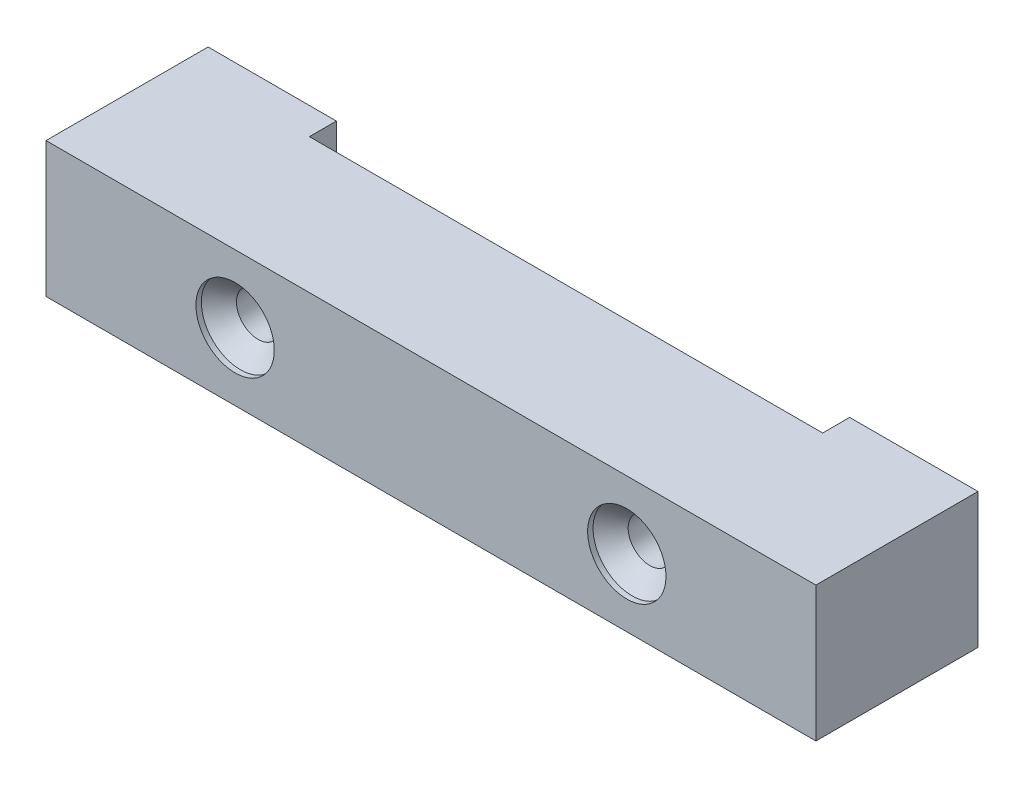
ISO-10303-21;
HEADER;
FILE_DESCRIPTION(('STEP AP214'),'2;1');
FILE_NAME('part.step','',(''),(''),'','','');
FILE_SCHEMA(('AUTOMOTIVE_DESIGN { 1 0 10303 214 1 1 1 1 }'));
ENDSEC;
DATA;
#1=APPLICATION_CONTEXT('core data for automotive mechanical design processes');
#2=APPLICATION_PROTOCOL_DEFINITION('international standard','automotive_design',2000,#1);
#3=PRODUCT_CONTEXT('',#1,'mechanical');
#4=PRODUCT('Part','Part','',(#3));
#5=PRODUCT_RELATED_PRODUCT_CATEGORY('part','',(#4));
#6=PRODUCT_DEFINITION_FORMATION('','',#4);
#7=PRODUCT_DEFINITION_CONTEXT('part definition',#1,'design');
#8=PRODUCT_DEFINITION('design','',#6,#7);
#9=PRODUCT_DEFINITION_SHAPE('','',#8);
#10=(LENGTH_UNIT() NAMED_UNIT(*) SI_UNIT(.MILLI.,.METRE.));
#11=(NAMED_UNIT(*) PLANE_ANGLE_UNIT() SI_UNIT($,.RADIAN.));
#12=(NAMED_UNIT(*) SI_UNIT($,.STERADIAN.) SOLID_ANGLE_UNIT());
#13=UNCERTAINTY_MEASURE_WITH_UNIT(LENGTH_MEASURE(1.E-05),#10,'distance_accuracy_value','');
#14=(GEOMETRIC_REPRESENTATION_CONTEXT(3) GLOBAL_UNCERTAINTY_ASSIGNED_CONTEXT((#13)) GLOBAL_UNIT_ASSIGNED_CONTEXT((#10,
#11,#12)) REPRESENTATION_CONTEXT('',''));
#15=CARTESIAN_POINT('',(0.,0.,0.));
#16=DIRECTION('',(0.,0.,1.));
#17=DIRECTION('',(1.,0.,0.));
#18=AXIS2_PLACEMENT_3D('',#15,#16,#17);
#19=CARTESIAN_POINT('',(28.5,10.,5.));
#20=DIRECTION('',(-1.,0.,0.));
#21=DIRECTION('',(0.,0.,1.));
#22=AXIS2_PLACEMENT_3D('',#19,#20,#21);
#23=PLANE('',#22);
#24=DIRECTION('',(0.,0.,-1.));
#25=VECTOR('',#24,1.);
#26=CARTESIAN_POINT('',(28.5,0.,5.));
#27=LINE('',#26,#25);
#28=CARTESIAN_POINT('',(28.5,0.,5.));
#29=VERTEX_POINT('',#28);
#30=CARTESIAN_POINT('',(28.5,0.,-7.));
#31=VERTEX_POINT('',#30);
#32=EDGE_CURVE('E130',#29,#31,#27,.T.);
#33=ORIENTED_EDGE('',*,*,#32,.T.);
#34=DIRECTION('',(0.,-1.,0.));
#35=VECTOR('',#34,1.);
#36=CARTESIAN_POINT('',(28.5,10.,-7.));
#37=LINE('',#36,#35);
#38=CARTESIAN_POINT('',(28.5,10.,-7.));
#39=VERTEX_POINT('',#38);
#40=EDGE_CURVE('E11',#39,#31,#37,.T.);
#41=ORIENTED_EDGE('',*,*,#40,.F.);
#42=DIRECTION('',(0.,0.,-1.));
#43=VECTOR('',#42,1.);
#44=CARTESIAN_POINT('',(28.5,10.,5.));
#45=LINE('',#44,#43);
#46=CARTESIAN_POINT('',(28.5,10.,5.));
#47=VERTEX_POINT('',#46);
#48=EDGE_CURVE('E145',#47,#39,#45,.T.);
#49=ORIENTED_EDGE('',*,*,#48,.F.);
#50=DIRECTION('',(0.,-1.,0.));
#51=VECTOR('',#50,1.);
#52=CARTESIAN_POINT('',(28.5,10.,5.));
#53=LINE('',#52,#51);
#54=EDGE_CURVE('E126',#47,#29,#53,.T.);
#55=ORIENTED_EDGE('',*,*,#54,.T.);
#56=EDGE_LOOP('',(#33,#41,#49,#55));
#57=FACE_BOUND('',#56,.T.);
#58=ADVANCED_FACE('F32',(#57),#23,.F.);
#59=CARTESIAN_POINT('',(28.5,10.,-7.));
#60=DIRECTION('',(0.,0.,1.));
#61=DIRECTION('',(1.,0.,0.));
#62=AXIS2_PLACEMENT_3D('',#59,#60,#61);
#63=PLANE('',#62);
#64=CARTESIAN_POINT('',(23.5,5.00000000000001,-7.));
#65=DIRECTION('',(0.,0.,-1.));
#66=DIRECTION('',(-1.,0.,0.));
#67=AXIS2_PLACEMENT_3D('',#64,#65,#66);
#68=CIRCLE('',#67,1.55);
#69=CARTESIAN_POINT('',(21.95,5.00000000000001,-7.));
#70=VERTEX_POINT('',#69);
#71=EDGE_CURVE('E158',#70,#70,#68,.T.);
#72=ORIENTED_EDGE('',*,*,#71,.F.);
#73=EDGE_LOOP('',(#72));
#74=FACE_BOUND('',#73,.T.);
#75=DIRECTION('',(-1.,0.,0.));
#76=VECTOR('',#75,1.);
#77=CARTESIAN_POINT('',(28.5,0.,-7.));
#78=LINE('',#77,#76);
#79=CARTESIAN_POINT('',(19.,0.,-7.));
#80=VERTEX_POINT('',#79);
#81=EDGE_CURVE('E133',#31,#80,#78,.T.);
#82=ORIENTED_EDGE('',*,*,#81,.T.);
#83=DIRECTION('',(0.,-1.,0.));
#84=VECTOR('',#83,1.);
#85=CARTESIAN_POINT('',(19.,10.,-7.));
#86=LINE('',#85,#84);
#87=CARTESIAN_POINT('',(19.,10.,-7.));
#88=VERTEX_POINT('',#87);
#89=EDGE_CURVE('E41',#88,#80,#86,.T.);
#90=ORIENTED_EDGE('',*,*,#89,.F.);
#91=DIRECTION('',(-1.,0.,0.));
#92=VECTOR('',#91,1.);
#93=CARTESIAN_POINT('',(28.5,10.,-7.));
#94=LINE('',#93,#92);
#95=EDGE_CURVE('E93',#39,#88,#94,.T.);
#96=ORIENTED_EDGE('',*,*,#95,.F.);
#97=ORIENTED_EDGE('',*,*,#40,.T.);
#98=EDGE_LOOP('',(#82,#90,#96,#97));
#99=FACE_BOUND('',#98,.T.);
#100=ADVANCED_FACE('F212',(#74,#99),#63,.F.);
#101=CARTESIAN_POINT('',(19.,10.,-7.));
#102=DIRECTION('',(1.,0.,0.));
#103=DIRECTION('',(0.,0.,-1.));
#104=AXIS2_PLACEMENT_3D('',#101,#102,#103);
#105=PLANE('',#104);
#106=DIRECTION('',(0.,0.,1.));
#107=VECTOR('',#106,1.);
#108=CARTESIAN_POINT('',(19.,0.,-7.));
#109=LINE('',#108,#107);
#110=CARTESIAN_POINT('',(19.,0.,-5.));
#111=VERTEX_POINT('',#110);
#112=EDGE_CURVE('E136',#80,#111,#109,.T.);
#113=ORIENTED_EDGE('',*,*,#112,.T.);
#114=DIRECTION('',(0.,-1.,0.));
#115=VECTOR('',#114,1.);
#116=CARTESIAN_POINT('',(19.,10.,-5.));
#117=LINE('',#116,#115);
#118=CARTESIAN_POINT('',(19.,10.,-5.));
#119=VERTEX_POINT('',#118);
#120=EDGE_CURVE('E152',#119,#111,#117,.T.);
#121=ORIENTED_EDGE('',*,*,#120,.F.);
#122=DIRECTION('',(0.,0.,1.));
#123=VECTOR('',#122,1.);
#124=CARTESIAN_POINT('',(19.,10.,-7.));
#125=LINE('',#124,#123);
#126=EDGE_CURVE('E178',#88,#119,#125,.T.);
#127=ORIENTED_EDGE('',*,*,#126,.F.);
#128=ORIENTED_EDGE('',*,*,#89,.T.);
#129=EDGE_LOOP('',(#113,#121,#127,#128));
#130=FACE_BOUND('',#129,.T.);
#131=ADVANCED_FACE('F216',(#130),#105,.F.);
#132=CARTESIAN_POINT('',(19.,10.,-5.));
#133=DIRECTION('',(0.,0.,1.));
#134=DIRECTION('',(1.,0.,0.));
#135=AXIS2_PLACEMENT_3D('',#132,#133,#134);
#136=PLANE('',#135);
#137=CARTESIAN_POINT('',(-14.5,5.00000000000001,-5.));
#138=DIRECTION('',(0.,0.,1.));
#139=DIRECTION('',(1.,0.,0.));
#140=AXIS2_PLACEMENT_3D('',#137,#138,#139);
#141=CIRCLE('',#140,1.6);
#142=CARTESIAN_POINT('',(-12.9,5.00000000000001,-5.));
#143=VERTEX_POINT('',#142);
#144=EDGE_CURVE('E35',#143,#143,#141,.T.);
#145=ORIENTED_EDGE('',*,*,#144,.T.);
#146=EDGE_LOOP('',(#145));
#147=FACE_BOUND('',#146,.T.);
#148=CARTESIAN_POINT('',(14.5,5.00000000000001,-5.));
#149=DIRECTION('',(0.,0.,1.));
#150=DIRECTION('',(1.,0.,0.));
#151=AXIS2_PLACEMENT_3D('',#148,#149,#150);
#152=CIRCLE('',#151,1.6);
#153=CARTESIAN_POINT('',(16.1,5.00000000000001,-5.));
#154=VERTEX_POINT('',#153);
#155=EDGE_CURVE('E156',#154,#154,#152,.T.);
#156=ORIENTED_EDGE('',*,*,#155,.T.);
#157=EDGE_LOOP('',(#156));
#158=FACE_BOUND('',#157,.T.);
#159=DIRECTION('',(-1.,0.,0.));
#160=VECTOR('',#159,1.);
#161=CARTESIAN_POINT('',(19.,0.,-5.));
#162=LINE('',#161,#160);
#163=CARTESIAN_POINT('',(-19.,0.,-5.));
#164=VERTEX_POINT('',#163);
#165=EDGE_CURVE('E138',#111,#164,#162,.T.);
#166=ORIENTED_EDGE('',*,*,#165,.T.);
#167=DIRECTION('',(0.,-1.,0.));
#168=VECTOR('',#167,1.);
#169=CARTESIAN_POINT('',(-19.,10.,-5.));
#170=LINE('',#169,#168);
#171=CARTESIAN_POINT('',(-19.,10.,-5.));
#172=VERTEX_POINT('',#171);
#173=EDGE_CURVE('E149',#172,#164,#170,.T.);
#174=ORIENTED_EDGE('',*,*,#173,.F.);
#175=DIRECTION('',(-1.,0.,0.));
#176=VECTOR('',#175,1.);
#177=CARTESIAN_POINT('',(19.,10.,-5.));
#178=LINE('',#177,#176);
#179=EDGE_CURVE('E180',#119,#172,#178,.T.);
#180=ORIENTED_EDGE('',*,*,#179,.F.);
#181=ORIENTED_EDGE('',*,*,#120,.T.);
#182=EDGE_LOOP('',(#166,#174,#180,#181));
#183=FACE_BOUND('',#182,.T.);
#184=ADVANCED_FACE('F186',(#147,#158,#183),#136,.F.);
#185=CARTESIAN_POINT('',(-19.,10.,-7.));
#186=DIRECTION('',(-1.,0.,0.));
#187=DIRECTION('',(0.,0.,1.));
#188=AXIS2_PLACEMENT_3D('',#185,#186,#187);
#189=PLANE('',#188);
#190=DIRECTION('',(0.,0.,-1.));
#191=VECTOR('',#190,1.);
#192=CARTESIAN_POINT('',(-19.,0.,-7.));
#193=LINE('',#192,#191);
#194=CARTESIAN_POINT('',(-19.,0.,-7.));
#195=VERTEX_POINT('',#194);
#196=EDGE_CURVE('E140',#164,#195,#193,.T.);
#197=ORIENTED_EDGE('',*,*,#196,.T.);
#198=DIRECTION('',(0.,-1.,0.));
#199=VECTOR('',#198,1.);
#200=CARTESIAN_POINT('',(-19.,10.,-7.));
#201=LINE('',#200,#199);
#202=CARTESIAN_POINT('',(-19.,10.,-7.));
#203=VERTEX_POINT('',#202);
#204=EDGE_CURVE('E121',#203,#195,#201,.T.);
#205=ORIENTED_EDGE('',*,*,#204,.F.);
#206=DIRECTION('',(0.,0.,-1.));
#207=VECTOR('',#206,1.);
#208=CARTESIAN_POINT('',(-19.,10.,-7.));
#209=LINE('',#208,#207);
#210=EDGE_CURVE('E112',#172,#203,#209,.T.);
#211=ORIENTED_EDGE('',*,*,#210,.F.);
#212=ORIENTED_EDGE('',*,*,#173,.T.);
#213=EDGE_LOOP('',(#197,#205,#211,#212));
#214=FACE_BOUND('',#213,.T.);
#215=ADVANCED_FACE('F190',(#214),#189,.F.);
#216=CARTESIAN_POINT('',(-28.5,10.,-7.));
#217=DIRECTION('',(0.,0.,1.));
#218=DIRECTION('',(1.,0.,0.));
#219=AXIS2_PLACEMENT_3D('',#216,#217,#218);
#220=PLANE('',#219);
#221=CARTESIAN_POINT('',(-23.5,5.00000000000001,-7.));
#222=DIRECTION('',(0.,0.,1.));
#223=DIRECTION('',(1.,0.,0.));
#224=AXIS2_PLACEMENT_3D('',#221,#222,#223);
#225=CIRCLE('',#224,1.55);
#226=CARTESIAN_POINT('',(-21.95,5.00000000000001,-7.));
#227=VERTEX_POINT('',#226);
#228=EDGE_CURVE('E236',#227,#227,#225,.T.);
#229=ORIENTED_EDGE('',*,*,#228,.T.);
#230=EDGE_LOOP('',(#229));
#231=FACE_BOUND('',#230,.T.);
#232=DIRECTION('',(-1.,0.,0.));
#233=VECTOR('',#232,1.);
#234=CARTESIAN_POINT('',(-28.5,0.,-7.));
#235=LINE('',#234,#233);
#236=CARTESIAN_POINT('',(-28.5,0.,-7.));
#237=VERTEX_POINT('',#236);
#238=EDGE_CURVE('E120',#195,#237,#235,.T.);
#239=ORIENTED_EDGE('',*,*,#238,.T.);
#240=DIRECTION('',(0.,-1.,0.));
#241=VECTOR('',#240,1.);
#242=CARTESIAN_POINT('',(-28.5,10.,-7.));
#243=LINE('',#242,#241);
#244=CARTESIAN_POINT('',(-28.5,10.,-7.));
#245=VERTEX_POINT('',#244);
#246=EDGE_CURVE('E117',#245,#237,#243,.T.);
#247=ORIENTED_EDGE('',*,*,#246,.F.);
#248=DIRECTION('',(-1.,0.,0.));
#249=VECTOR('',#248,1.);
#250=CARTESIAN_POINT('',(-28.5,10.,-7.));
#251=LINE('',#250,#249);
#252=EDGE_CURVE('E106',#203,#245,#251,.T.);
#253=ORIENTED_EDGE('',*,*,#252,.F.);
#254=ORIENTED_EDGE('',*,*,#204,.T.);
#255=EDGE_LOOP('',(#239,#247,#253,#254));
#256=FACE_BOUND('',#255,.T.);
#257=ADVANCED_FACE('F118',(#231,#256),#220,.F.);
#258=CARTESIAN_POINT('',(-28.5,10.,5.));
#259=DIRECTION('',(1.,0.,0.));
#260=DIRECTION('',(0.,0.,-1.));
#261=AXIS2_PLACEMENT_3D('',#258,#259,#260);
#262=PLANE('',#261);
#263=DIRECTION('',(0.,0.,1.));
#264=VECTOR('',#263,1.);
#265=CARTESIAN_POINT('',(-28.5,0.,5.));
#266=LINE('',#265,#264);
#267=CARTESIAN_POINT('',(-28.5,0.,5.));
#268=VERTEX_POINT('',#267);
#269=EDGE_CURVE('E79',#237,#268,#266,.T.);
#270=ORIENTED_EDGE('',*,*,#269,.T.);
#271=DIRECTION('',(0.,-1.,0.));
#272=VECTOR('',#271,1.);
#273=CARTESIAN_POINT('',(-28.5,10.,5.));
#274=LINE('',#273,#272);
#275=CARTESIAN_POINT('',(-28.5,10.,5.));
#276=VERTEX_POINT('',#275);
#277=EDGE_CURVE('E122',#276,#268,#274,.T.);
#278=ORIENTED_EDGE('',*,*,#277,.F.);
#279=DIRECTION('',(0.,0.,1.));
#280=VECTOR('',#279,1.);
#281=CARTESIAN_POINT('',(-28.5,10.,5.));
#282=LINE('',#281,#280);
#283=EDGE_CURVE('E110',#245,#276,#282,.T.);
#284=ORIENTED_EDGE('',*,*,#283,.F.);
#285=ORIENTED_EDGE('',*,*,#246,.T.);
#286=EDGE_LOOP('',(#270,#278,#284,#285));
#287=FACE_BOUND('',#286,.T.);
#288=ADVANCED_FACE('F124',(#287),#262,.F.);
#289=CARTESIAN_POINT('',(-28.5,10.,5.));
#290=DIRECTION('',(0.,0.,-1.));
#291=DIRECTION('',(-1.,0.,0.));
#292=AXIS2_PLACEMENT_3D('',#289,#290,#291);
#293=PLANE('',#292);
#294=CARTESIAN_POINT('',(-14.5,5.00000000000001,5.));
#295=DIRECTION('',(0.,0.,1.));
#296=DIRECTION('',(1.,0.,0.));
#297=AXIS2_PLACEMENT_3D('',#294,#295,#296);
#298=CIRCLE('',#297,2.9);
#299=CARTESIAN_POINT('',(-11.6,5.00000000000001,5.));
#300=VERTEX_POINT('',#299);
#301=EDGE_CURVE('E372',#300,#300,#298,.T.);
#302=ORIENTED_EDGE('',*,*,#301,.F.);
#303=EDGE_LOOP('',(#302));
#304=FACE_BOUND('',#303,.T.);
#305=CARTESIAN_POINT('',(14.5,5.00000000000001,5.));
#306=DIRECTION('',(0.,0.,1.));
#307=DIRECTION('',(1.,0.,0.));
#308=AXIS2_PLACEMENT_3D('',#305,#306,#307);
#309=CIRCLE('',#308,2.9);
#310=CARTESIAN_POINT('',(17.4,5.00000000000001,5.));
#311=VERTEX_POINT('',#310);
#312=EDGE_CURVE('E170',#311,#311,#309,.T.);
#313=ORIENTED_EDGE('',*,*,#312,.F.);
#314=EDGE_LOOP('',(#313));
#315=FACE_BOUND('',#314,.T.);
#316=DIRECTION('',(1.,0.,0.));
#317=VECTOR('',#316,1.);
#318=CARTESIAN_POINT('',(-28.5,0.,5.));
#319=LINE('',#318,#317);
#320=EDGE_CURVE('E85',#268,#29,#319,.T.);
#321=ORIENTED_EDGE('',*,*,#320,.T.);
#322=ORIENTED_EDGE('',*,*,#54,.F.);
#323=DIRECTION('',(1.,0.,0.));
#324=VECTOR('',#323,1.);
#325=CARTESIAN_POINT('',(-28.5,10.,5.));
#326=LINE('',#325,#324);
#327=EDGE_CURVE('E50',#276,#47,#326,.T.);
#328=ORIENTED_EDGE('',*,*,#327,.F.);
#329=ORIENTED_EDGE('',*,*,#277,.T.);
#330=EDGE_LOOP('',(#321,#322,#328,#329));
#331=FACE_BOUND('',#330,.T.);
#332=ADVANCED_FACE('F198',(#304,#315,#331),#293,.F.);
#333=CARTESIAN_POINT('',(0.,10.,0.));
#334=DIRECTION('',(0.,1.,0.));
#335=DIRECTION('',(0.,0.,1.));
#336=AXIS2_PLACEMENT_3D('',#333,#334,#335);
#337=PLANE('',#336);
#338=ORIENTED_EDGE('',*,*,#48,.T.);
#339=ORIENTED_EDGE('',*,*,#95,.T.);
#340=ORIENTED_EDGE('',*,*,#126,.T.);
#341=ORIENTED_EDGE('',*,*,#179,.T.);
#342=ORIENTED_EDGE('',*,*,#210,.T.);
#343=ORIENTED_EDGE('',*,*,#252,.T.);
#344=ORIENTED_EDGE('',*,*,#283,.T.);
#345=ORIENTED_EDGE('',*,*,#327,.T.);
#346=EDGE_LOOP('',(#338,#339,#340,#341,#342,#343,#344,#345));
#347=FACE_BOUND('',#346,.T.);
#348=ADVANCED_FACE('F108',(#347),#337,.T.);
#349=CARTESIAN_POINT('',(0.,0.,0.));
#350=DIRECTION('',(0.,1.,0.));
#351=DIRECTION('',(0.,0.,1.));
#352=AXIS2_PLACEMENT_3D('',#349,#350,#351);
#353=PLANE('',#352);
#354=ORIENTED_EDGE('',*,*,#32,.F.);
#355=ORIENTED_EDGE('',*,*,#320,.F.);
#356=ORIENTED_EDGE('',*,*,#269,.F.);
#357=ORIENTED_EDGE('',*,*,#238,.F.);
#358=ORIENTED_EDGE('',*,*,#196,.F.);
#359=ORIENTED_EDGE('',*,*,#165,.F.);
#360=ORIENTED_EDGE('',*,*,#112,.F.);
#361=ORIENTED_EDGE('',*,*,#81,.F.);
#362=EDGE_LOOP('',(#354,#355,#356,#357,#358,#359,#360,#361));
#363=FACE_BOUND('',#362,.T.);
#364=ADVANCED_FACE('F193',(#363),#353,.F.);
#365=CARTESIAN_POINT('',(23.5,5.00000000000001,0.));
#366=DIRECTION('',(0.,0.,-1.));
#367=DIRECTION('',(-1.,0.,0.));
#368=AXIS2_PLACEMENT_3D('',#365,#366,#367);
#369=CYLINDRICAL_SURFACE('',#368,1.55);
#370=CARTESIAN_POINT('',(23.5,5.00000000000001,0.));
#371=DIRECTION('',(0.,0.,-1.));
#372=DIRECTION('',(-1.,0.,0.));
#373=AXIS2_PLACEMENT_3D('',#370,#371,#372);
#374=CIRCLE('',#373,1.55);
#375=CARTESIAN_POINT('',(21.95,5.00000000000001,0.));
#376=VERTEX_POINT('',#375);
#377=EDGE_CURVE('E134',#376,#376,#374,.T.);
#378=ORIENTED_EDGE('',*,*,#377,.F.);
#379=EDGE_LOOP('',(#378));
#380=FACE_BOUND('',#379,.T.);
#381=ORIENTED_EDGE('',*,*,#71,.T.);
#382=EDGE_LOOP('',(#381));
#383=FACE_BOUND('',#382,.T.);
#384=ADVANCED_FACE('F272',(#380,#383),#369,.F.);
#385=CARTESIAN_POINT('',(23.5,5.00000000000001,0.));
#386=DIRECTION('',(0.,0.,-1.));
#387=DIRECTION('',(-1.,0.,0.));
#388=AXIS2_PLACEMENT_3D('',#385,#386,#387);
#389=PLANE('',#388);
#390=ORIENTED_EDGE('',*,*,#377,.T.);
#391=EDGE_LOOP('',(#390));
#392=FACE_BOUND('',#391,.T.);
#393=ADVANCED_FACE('F269',(#392),#389,.T.);
#394=CARTESIAN_POINT('',(14.5,5.00000000000001,5.));
#395=DIRECTION('',(0.,0.,1.));
#396=DIRECTION('',(1.,0.,0.));
#397=AXIS2_PLACEMENT_3D('',#394,#395,#396);
#398=CYLINDRICAL_SURFACE('',#397,1.6);
#399=CARTESIAN_POINT('',(14.5,5.00000000000001,3.30000000000001));
#400=DIRECTION('',(0.,0.,1.));
#401=DIRECTION('',(1.,0.,0.));
#402=AXIS2_PLACEMENT_3D('',#399,#400,#401);
#403=CIRCLE('',#402,1.6);
#404=CARTESIAN_POINT('',(16.1,5.00000000000001,3.30000000000001));
#405=VERTEX_POINT('',#404);
#406=EDGE_CURVE('E159',#405,#405,#403,.T.);
#407=ORIENTED_EDGE('',*,*,#406,.T.);
#408=EDGE_LOOP('',(#407));
#409=FACE_BOUND('',#408,.T.);
#410=ORIENTED_EDGE('',*,*,#155,.F.);
#411=EDGE_LOOP('',(#410));
#412=FACE_BOUND('',#411,.T.);
#413=ADVANCED_FACE('F261',(#409,#412),#398,.F.);
#414=CARTESIAN_POINT('',(14.5,5.00000000000001,4.6));
#415=DIRECTION('',(0.,0.,1.));
#416=DIRECTION('',(1.,0.,0.));
#417=AXIS2_PLACEMENT_3D('',#414,#415,#416);
#418=CONICAL_SURFACE('',#417,2.9,0.78539816339745);
#419=ORIENTED_EDGE('',*,*,#406,.F.);
#420=EDGE_LOOP('',(#419));
#421=FACE_BOUND('',#420,.T.);
#422=CARTESIAN_POINT('',(14.5,5.00000000000001,4.6));
#423=DIRECTION('',(0.,0.,1.));
#424=DIRECTION('',(1.,0.,0.));
#425=AXIS2_PLACEMENT_3D('',#422,#423,#424);
#426=CIRCLE('',#425,2.9);
#427=CARTESIAN_POINT('',(17.4,5.00000000000001,4.6));
#428=VERTEX_POINT('',#427);
#429=EDGE_CURVE('E165',#428,#428,#426,.T.);
#430=ORIENTED_EDGE('',*,*,#429,.T.);
#431=EDGE_LOOP('',(#430));
#432=FACE_BOUND('',#431,.T.);
#433=ADVANCED_FACE('F251',(#421,#432),#418,.F.);
#434=CARTESIAN_POINT('',(14.5,5.00000000000001,5.));
#435=DIRECTION('',(0.,0.,1.));
#436=DIRECTION('',(1.,0.,0.));
#437=AXIS2_PLACEMENT_3D('',#434,#435,#436);
#438=CYLINDRICAL_SURFACE('',#437,2.9);
#439=ORIENTED_EDGE('',*,*,#429,.F.);
#440=EDGE_LOOP('',(#439));
#441=FACE_BOUND('',#440,.T.);
#442=ORIENTED_EDGE('',*,*,#312,.T.);
#443=EDGE_LOOP('',(#442));
#444=FACE_BOUND('',#443,.T.);
#445=ADVANCED_FACE('F248',(#441,#444),#438,.F.);
#446=CARTESIAN_POINT('',(-23.5,5.00000000000001,0.));
#447=DIRECTION('',(0.,0.,-1.));
#448=DIRECTION('',(-1.,0.,0.));
#449=AXIS2_PLACEMENT_3D('',#446,#447,#448);
#450=CYLINDRICAL_SURFACE('',#449,1.55);
#451=CARTESIAN_POINT('',(-23.5,5.00000000000001,0.));
#452=DIRECTION('',(0.,0.,1.));
#453=DIRECTION('',(1.,0.,0.));
#454=AXIS2_PLACEMENT_3D('',#451,#452,#453);
#455=CIRCLE('',#454,1.55);
#456=CARTESIAN_POINT('',(-21.95,5.00000000000001,0.));
#457=VERTEX_POINT('',#456);
#458=EDGE_CURVE('E238',#457,#457,#455,.T.);
#459=ORIENTED_EDGE('',*,*,#458,.T.);
#460=EDGE_LOOP('',(#459));
#461=FACE_BOUND('',#460,.T.);
#462=ORIENTED_EDGE('',*,*,#228,.F.);
#463=EDGE_LOOP('',(#462));
#464=FACE_BOUND('',#463,.T.);
#465=ADVANCED_FACE('F250',(#461,#464),#450,.F.);
#466=CARTESIAN_POINT('',(-23.5,5.00000000000001,0.));
#467=DIRECTION('',(0.,0.,-1.));
#468=DIRECTION('',(1.,0.,0.));
#469=AXIS2_PLACEMENT_3D('',#466,#467,#468);
#470=PLANE('',#469);
#471=ORIENTED_EDGE('',*,*,#458,.F.);
#472=EDGE_LOOP('',(#471));
#473=FACE_BOUND('',#472,.T.);
#474=ADVANCED_FACE('F258',(#473),#470,.T.);
#475=CARTESIAN_POINT('',(-14.5,5.00000000000001,5.));
#476=DIRECTION('',(0.,0.,1.));
#477=DIRECTION('',(1.,0.,0.));
#478=AXIS2_PLACEMENT_3D('',#475,#476,#477);
#479=CYLINDRICAL_SURFACE('',#478,1.6);
#480=CARTESIAN_POINT('',(-14.5,5.00000000000001,3.30000000000001));
#481=DIRECTION('',(0.,0.,1.));
#482=DIRECTION('',(1.,0.,0.));
#483=AXIS2_PLACEMENT_3D('',#480,#481,#482);
#484=CIRCLE('',#483,1.6);
#485=CARTESIAN_POINT('',(-12.9,5.00000000000001,3.30000000000001));
#486=VERTEX_POINT('',#485);
#487=EDGE_CURVE('E243',#486,#486,#484,.T.);
#488=ORIENTED_EDGE('',*,*,#487,.T.);
#489=EDGE_LOOP('',(#488));
#490=FACE_BOUND('',#489,.T.);
#491=ORIENTED_EDGE('',*,*,#144,.F.);
#492=EDGE_LOOP('',(#491));
#493=FACE_BOUND('',#492,.T.);
#494=ADVANCED_FACE('F334',(#490,#493),#479,.F.);
#495=CARTESIAN_POINT('',(-14.5,5.00000000000001,4.6));
#496=DIRECTION('',(0.,0.,1.));
#497=DIRECTION('',(1.,0.,0.));
#498=AXIS2_PLACEMENT_3D('',#495,#496,#497);
#499=CONICAL_SURFACE('',#498,2.9,0.78539816339745);
#500=ORIENTED_EDGE('',*,*,#487,.F.);
#501=EDGE_LOOP('',(#500));
#502=FACE_BOUND('',#501,.T.);
#503=CARTESIAN_POINT('',(-14.5,5.00000000000001,4.6));
#504=DIRECTION('',(0.,0.,1.));
#505=DIRECTION('',(1.,0.,0.));
#506=AXIS2_PLACEMENT_3D('',#503,#504,#505);
#507=CIRCLE('',#506,2.9);
#508=CARTESIAN_POINT('',(-11.6,5.00000000000001,4.6));
#509=VERTEX_POINT('',#508);
#510=EDGE_CURVE('E370',#509,#509,#507,.T.);
#511=ORIENTED_EDGE('',*,*,#510,.T.);
#512=EDGE_LOOP('',(#511));
#513=FACE_BOUND('',#512,.T.);
#514=ADVANCED_FACE('F343',(#502,#513),#499,.F.);
#515=CARTESIAN_POINT('',(-14.5,5.00000000000001,5.));
#516=DIRECTION('',(0.,0.,1.));
#517=DIRECTION('',(1.,0.,0.));
#518=AXIS2_PLACEMENT_3D('',#515,#516,#517);
#519=CYLINDRICAL_SURFACE('',#518,2.9);
#520=ORIENTED_EDGE('',*,*,#510,.F.);
#521=EDGE_LOOP('',(#520));
#522=FACE_BOUND('',#521,.T.);
#523=ORIENTED_EDGE('',*,*,#301,.T.);
#524=EDGE_LOOP('',(#523));
#525=FACE_BOUND('',#524,.T.);
#526=ADVANCED_FACE('F353',(#522,#525),#519,.F.);
#527=CLOSED_SHELL('',(#58,#100,#131,#184,#215,#257,#288,#332,#348,#364,#384,#393,#413,#433,#445,
#465,#474,#494,#514,#526));
#528=MANIFOLD_SOLID_BREP('B2',#527);
#529=ADVANCED_BREP_SHAPE_REPRESENTATION('',(#18,#528),#14);
#530=SHAPE_DEFINITION_REPRESENTATION(#9,#529);
ENDSEC;
END-ISO-10303-21;
